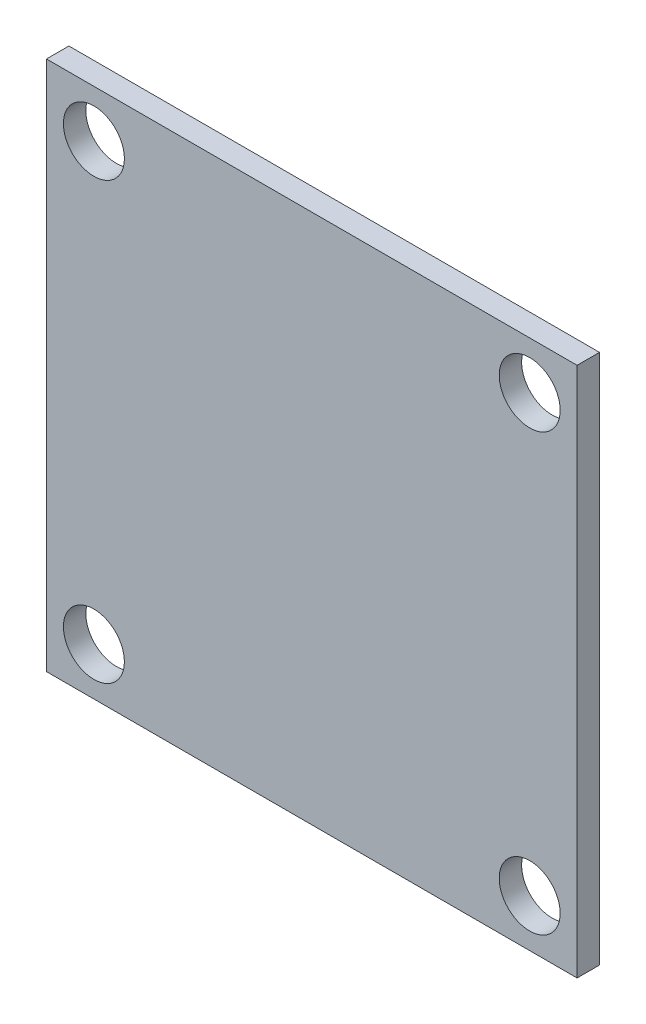
ISO-10303-21;
HEADER;
FILE_DESCRIPTION(('STEP AP214'),'2;1');
FILE_NAME('part.step','',(''),(''),'','','');
FILE_SCHEMA(('AUTOMOTIVE_DESIGN { 1 0 10303 214 1 1 1 1 }'));
ENDSEC;
DATA;
#1=APPLICATION_CONTEXT('core data for automotive mechanical design processes');
#2=APPLICATION_PROTOCOL_DEFINITION('international standard','automotive_design',2000,#1);
#3=PRODUCT_CONTEXT('',#1,'mechanical');
#4=PRODUCT('Part','Part','',(#3));
#5=PRODUCT_RELATED_PRODUCT_CATEGORY('part','',(#4));
#6=PRODUCT_DEFINITION_FORMATION('','',#4);
#7=PRODUCT_DEFINITION_CONTEXT('part definition',#1,'design');
#8=PRODUCT_DEFINITION('design','',#6,#7);
#9=PRODUCT_DEFINITION_SHAPE('','',#8);
#10=(LENGTH_UNIT() NAMED_UNIT(*) SI_UNIT(.MILLI.,.METRE.));
#11=(NAMED_UNIT(*) PLANE_ANGLE_UNIT() SI_UNIT($,.RADIAN.));
#12=(NAMED_UNIT(*) SI_UNIT($,.STERADIAN.) SOLID_ANGLE_UNIT());
#13=UNCERTAINTY_MEASURE_WITH_UNIT(LENGTH_MEASURE(1.E-05),#10,'distance_accuracy_value','');
#14=(GEOMETRIC_REPRESENTATION_CONTEXT(3) GLOBAL_UNCERTAINTY_ASSIGNED_CONTEXT((#13)) GLOBAL_UNIT_ASSIGNED_CONTEXT((#10,
#11,#12)) REPRESENTATION_CONTEXT('',''));
#15=CARTESIAN_POINT('',(0.,0.,0.));
#16=DIRECTION('',(0.,0.,1.));
#17=DIRECTION('',(1.,0.,0.));
#18=AXIS2_PLACEMENT_3D('',#15,#16,#17);
#19=CARTESIAN_POINT('',(14.2,14.2,1.2));
#20=DIRECTION('',(-1.,0.,0.));
#21=DIRECTION('',(0.,0.,1.));
#22=AXIS2_PLACEMENT_3D('',#19,#20,#21);
#23=PLANE('',#22);
#24=DIRECTION('',(0.,1.,0.));
#25=VECTOR('',#24,1.);
#26=CARTESIAN_POINT('',(14.2,14.2,0.));
#27=LINE('',#26,#25);
#28=CARTESIAN_POINT('',(14.2,-14.2,0.));
#29=VERTEX_POINT('',#28);
#30=CARTESIAN_POINT('',(14.2,14.2,0.));
#31=VERTEX_POINT('',#30);
#32=EDGE_CURVE('E98',#29,#31,#27,.T.);
#33=ORIENTED_EDGE('',*,*,#32,.T.);
#34=DIRECTION('',(0.,0.,-1.));
#35=VECTOR('',#34,1.);
#36=CARTESIAN_POINT('',(14.2,14.2,1.2));
#37=LINE('',#36,#35);
#38=CARTESIAN_POINT('',(14.2,14.2,1.2));
#39=VERTEX_POINT('',#38);
#40=EDGE_CURVE('E11',#39,#31,#37,.T.);
#41=ORIENTED_EDGE('',*,*,#40,.F.);
#42=DIRECTION('',(0.,1.,0.));
#43=VECTOR('',#42,1.);
#44=CARTESIAN_POINT('',(14.2,14.2,1.2));
#45=LINE('',#44,#43);
#46=CARTESIAN_POINT('',(14.2,-14.2,1.2));
#47=VERTEX_POINT('',#46);
#48=EDGE_CURVE('E86',#47,#39,#45,.T.);
#49=ORIENTED_EDGE('',*,*,#48,.F.);
#50=DIRECTION('',(0.,0.,-1.));
#51=VECTOR('',#50,1.);
#52=CARTESIAN_POINT('',(14.2,-14.2,1.2));
#53=LINE('',#52,#51);
#54=EDGE_CURVE('E94',#47,#29,#53,.T.);
#55=ORIENTED_EDGE('',*,*,#54,.T.);
#56=EDGE_LOOP('',(#33,#41,#49,#55));
#57=FACE_BOUND('',#56,.T.);
#58=ADVANCED_FACE('F35',(#57),#23,.F.);
#59=CARTESIAN_POINT('',(-14.2,14.2,1.2));
#60=DIRECTION('',(0.,-1.,0.));
#61=DIRECTION('',(0.,0.,-1.));
#62=AXIS2_PLACEMENT_3D('',#59,#60,#61);
#63=PLANE('',#62);
#64=DIRECTION('',(-1.,0.,0.));
#65=VECTOR('',#64,1.);
#66=CARTESIAN_POINT('',(-14.2,14.2,0.));
#67=LINE('',#66,#65);
#68=CARTESIAN_POINT('',(-14.2,14.2,0.));
#69=VERTEX_POINT('',#68);
#70=EDGE_CURVE('E90',#31,#69,#67,.T.);
#71=ORIENTED_EDGE('',*,*,#70,.T.);
#72=DIRECTION('',(0.,0.,-1.));
#73=VECTOR('',#72,1.);
#74=CARTESIAN_POINT('',(-14.2,14.2,1.2));
#75=LINE('',#74,#73);
#76=CARTESIAN_POINT('',(-14.2,14.2,1.2));
#77=VERTEX_POINT('',#76);
#78=EDGE_CURVE('E43',#77,#69,#75,.T.);
#79=ORIENTED_EDGE('',*,*,#78,.F.);
#80=DIRECTION('',(-1.,0.,0.));
#81=VECTOR('',#80,1.);
#82=CARTESIAN_POINT('',(-14.2,14.2,1.2));
#83=LINE('',#82,#81);
#84=EDGE_CURVE('E81',#39,#77,#83,.T.);
#85=ORIENTED_EDGE('',*,*,#84,.F.);
#86=ORIENTED_EDGE('',*,*,#40,.T.);
#87=EDGE_LOOP('',(#71,#79,#85,#86));
#88=FACE_BOUND('',#87,.T.);
#89=ADVANCED_FACE('F89',(#88),#63,.F.);
#90=CARTESIAN_POINT('',(-14.2,14.2,1.2));
#91=DIRECTION('',(1.,0.,0.));
#92=DIRECTION('',(0.,0.,-1.));
#93=AXIS2_PLACEMENT_3D('',#90,#91,#92);
#94=PLANE('',#93);
#95=DIRECTION('',(0.,-1.,0.));
#96=VECTOR('',#95,1.);
#97=CARTESIAN_POINT('',(-14.2,14.2,0.));
#98=LINE('',#97,#96);
#99=CARTESIAN_POINT('',(-14.2,-14.2,0.));
#100=VERTEX_POINT('',#99);
#101=EDGE_CURVE('E68',#69,#100,#98,.T.);
#102=ORIENTED_EDGE('',*,*,#101,.T.);
#103=DIRECTION('',(0.,0.,-1.));
#104=VECTOR('',#103,1.);
#105=CARTESIAN_POINT('',(-14.2,-14.2,1.2));
#106=LINE('',#105,#104);
#107=CARTESIAN_POINT('',(-14.2,-14.2,1.2));
#108=VERTEX_POINT('',#107);
#109=EDGE_CURVE('E91',#108,#100,#106,.T.);
#110=ORIENTED_EDGE('',*,*,#109,.F.);
#111=DIRECTION('',(0.,-1.,0.));
#112=VECTOR('',#111,1.);
#113=CARTESIAN_POINT('',(-14.2,14.2,1.2));
#114=LINE('',#113,#112);
#115=EDGE_CURVE('E84',#77,#108,#114,.T.);
#116=ORIENTED_EDGE('',*,*,#115,.F.);
#117=ORIENTED_EDGE('',*,*,#78,.T.);
#118=EDGE_LOOP('',(#102,#110,#116,#117));
#119=FACE_BOUND('',#118,.T.);
#120=ADVANCED_FACE('F92',(#119),#94,.F.);
#121=CARTESIAN_POINT('',(-14.2,-14.2,1.2));
#122=DIRECTION('',(0.,1.,0.));
#123=DIRECTION('',(0.,0.,1.));
#124=AXIS2_PLACEMENT_3D('',#121,#122,#123);
#125=PLANE('',#124);
#126=DIRECTION('',(1.,0.,0.));
#127=VECTOR('',#126,1.);
#128=CARTESIAN_POINT('',(-14.2,-14.2,0.));
#129=LINE('',#128,#127);
#130=EDGE_CURVE('E74',#100,#29,#129,.T.);
#131=ORIENTED_EDGE('',*,*,#130,.T.);
#132=ORIENTED_EDGE('',*,*,#54,.F.);
#133=DIRECTION('',(1.,0.,0.));
#134=VECTOR('',#133,1.);
#135=CARTESIAN_POINT('',(-14.2,-14.2,1.2));
#136=LINE('',#135,#134);
#137=EDGE_CURVE('E51',#108,#47,#136,.T.);
#138=ORIENTED_EDGE('',*,*,#137,.F.);
#139=ORIENTED_EDGE('',*,*,#109,.T.);
#140=EDGE_LOOP('',(#131,#132,#138,#139));
#141=FACE_BOUND('',#140,.T.);
#142=ADVANCED_FACE('F106',(#141),#125,.F.);
#143=CARTESIAN_POINT('',(0.,0.,1.2));
#144=DIRECTION('',(0.,0.,1.));
#145=DIRECTION('',(1.,0.,0.));
#146=AXIS2_PLACEMENT_3D('',#143,#144,#145);
#147=PLANE('',#146);
#148=CARTESIAN_POINT('',(-11.6625,11.66,1.2));
#149=DIRECTION('',(0.,0.,1.));
#150=DIRECTION('',(1.,0.,0.));
#151=AXIS2_PLACEMENT_3D('',#148,#149,#150);
#152=CIRCLE('',#151,1.63194999999999);
#153=CARTESIAN_POINT('',(-10.03055,11.66,1.2));
#154=VERTEX_POINT('',#153);
#155=EDGE_CURVE('E132',#154,#154,#152,.T.);
#156=ORIENTED_EDGE('',*,*,#155,.F.);
#157=EDGE_LOOP('',(#156));
#158=FACE_BOUND('',#157,.T.);
#159=CARTESIAN_POINT('',(11.6625,11.66,1.2));
#160=DIRECTION('',(0.,0.,1.));
#161=DIRECTION('',(1.,0.,0.));
#162=AXIS2_PLACEMENT_3D('',#159,#160,#161);
#163=CIRCLE('',#162,1.63194999999999);
#164=CARTESIAN_POINT('',(13.29445,11.66,1.2));
#165=VERTEX_POINT('',#164);
#166=EDGE_CURVE('E126',#165,#165,#163,.T.);
#167=ORIENTED_EDGE('',*,*,#166,.F.);
#168=EDGE_LOOP('',(#167));
#169=FACE_BOUND('',#168,.T.);
#170=CARTESIAN_POINT('',(-11.6625,-11.66,1.2));
#171=DIRECTION('',(0.,0.,1.));
#172=DIRECTION('',(1.,0.,0.));
#173=AXIS2_PLACEMENT_3D('',#170,#171,#172);
#174=CIRCLE('',#173,1.63194999999999);
#175=CARTESIAN_POINT('',(-10.03055,-11.66,1.2));
#176=VERTEX_POINT('',#175);
#177=EDGE_CURVE('E120',#176,#176,#174,.T.);
#178=ORIENTED_EDGE('',*,*,#177,.F.);
#179=EDGE_LOOP('',(#178));
#180=FACE_BOUND('',#179,.T.);
#181=CARTESIAN_POINT('',(11.6625,-11.66,1.2));
#182=DIRECTION('',(0.,0.,1.));
#183=DIRECTION('',(1.,0.,0.));
#184=AXIS2_PLACEMENT_3D('',#181,#182,#183);
#185=CIRCLE('',#184,1.63194999999999);
#186=CARTESIAN_POINT('',(13.29445,-11.66,1.2));
#187=VERTEX_POINT('',#186);
#188=EDGE_CURVE('E114',#187,#187,#185,.T.);
#189=ORIENTED_EDGE('',*,*,#188,.F.);
#190=EDGE_LOOP('',(#189));
#191=FACE_BOUND('',#190,.T.);
#192=ORIENTED_EDGE('',*,*,#48,.T.);
#193=ORIENTED_EDGE('',*,*,#84,.T.);
#194=ORIENTED_EDGE('',*,*,#115,.T.);
#195=ORIENTED_EDGE('',*,*,#137,.T.);
#196=EDGE_LOOP('',(#192,#193,#194,#195));
#197=FACE_BOUND('',#196,.T.);
#198=ADVANCED_FACE('F82',(#158,#169,#180,#191,#197),#147,.T.);
#199=CARTESIAN_POINT('',(0.,0.,0.));
#200=DIRECTION('',(0.,0.,1.));
#201=DIRECTION('',(1.,0.,0.));
#202=AXIS2_PLACEMENT_3D('',#199,#200,#201);
#203=PLANE('',#202);
#204=CARTESIAN_POINT('',(-11.6625,11.66,0.));
#205=DIRECTION('',(0.,0.,1.));
#206=DIRECTION('',(1.,0.,0.));
#207=AXIS2_PLACEMENT_3D('',#204,#205,#206);
#208=CIRCLE('',#207,1.63195);
#209=CARTESIAN_POINT('',(-10.03055,11.66,0.));
#210=VERTEX_POINT('',#209);
#211=EDGE_CURVE('E129',#210,#210,#208,.T.);
#212=ORIENTED_EDGE('',*,*,#211,.T.);
#213=EDGE_LOOP('',(#212));
#214=FACE_BOUND('',#213,.T.);
#215=CARTESIAN_POINT('',(11.6625,11.66,0.));
#216=DIRECTION('',(0.,0.,1.));
#217=DIRECTION('',(1.,0.,0.));
#218=AXIS2_PLACEMENT_3D('',#215,#216,#217);
#219=CIRCLE('',#218,1.63195);
#220=CARTESIAN_POINT('',(13.29445,11.66,0.));
#221=VERTEX_POINT('',#220);
#222=EDGE_CURVE('E123',#221,#221,#219,.T.);
#223=ORIENTED_EDGE('',*,*,#222,.T.);
#224=EDGE_LOOP('',(#223));
#225=FACE_BOUND('',#224,.T.);
#226=CARTESIAN_POINT('',(-11.6625,-11.66,0.));
#227=DIRECTION('',(0.,0.,1.));
#228=DIRECTION('',(1.,0.,0.));
#229=AXIS2_PLACEMENT_3D('',#226,#227,#228);
#230=CIRCLE('',#229,1.63195);
#231=CARTESIAN_POINT('',(-10.03055,-11.66,0.));
#232=VERTEX_POINT('',#231);
#233=EDGE_CURVE('E117',#232,#232,#230,.T.);
#234=ORIENTED_EDGE('',*,*,#233,.T.);
#235=EDGE_LOOP('',(#234));
#236=FACE_BOUND('',#235,.T.);
#237=CARTESIAN_POINT('',(11.6625,-11.66,0.));
#238=DIRECTION('',(0.,0.,1.));
#239=DIRECTION('',(1.,0.,0.));
#240=AXIS2_PLACEMENT_3D('',#237,#238,#239);
#241=CIRCLE('',#240,1.63195);
#242=CARTESIAN_POINT('',(13.29445,-11.66,0.));
#243=VERTEX_POINT('',#242);
#244=EDGE_CURVE('E101',#243,#243,#241,.T.);
#245=ORIENTED_EDGE('',*,*,#244,.T.);
#246=EDGE_LOOP('',(#245));
#247=FACE_BOUND('',#246,.T.);
#248=ORIENTED_EDGE('',*,*,#32,.F.);
#249=ORIENTED_EDGE('',*,*,#130,.F.);
#250=ORIENTED_EDGE('',*,*,#101,.F.);
#251=ORIENTED_EDGE('',*,*,#70,.F.);
#252=EDGE_LOOP('',(#248,#249,#250,#251));
#253=FACE_BOUND('',#252,.T.);
#254=ADVANCED_FACE('F109',(#214,#225,#236,#247,#253),#203,.F.);
#255=CARTESIAN_POINT('',(11.6625,-11.66,1.2));
#256=DIRECTION('',(0.,0.,1.));
#257=DIRECTION('',(1.,0.,0.));
#258=AXIS2_PLACEMENT_3D('',#255,#256,#257);
#259=CYLINDRICAL_SURFACE('',#258,1.63194999999999);
#260=ORIENTED_EDGE('',*,*,#244,.F.);
#261=EDGE_LOOP('',(#260));
#262=FACE_BOUND('',#261,.T.);
#263=ORIENTED_EDGE('',*,*,#188,.T.);
#264=EDGE_LOOP('',(#263));
#265=FACE_BOUND('',#264,.T.);
#266=ADVANCED_FACE('F147',(#262,#265),#259,.F.);
#267=CARTESIAN_POINT('',(-11.6625,-11.66,1.2));
#268=DIRECTION('',(0.,0.,1.));
#269=DIRECTION('',(1.,0.,0.));
#270=AXIS2_PLACEMENT_3D('',#267,#268,#269);
#271=CYLINDRICAL_SURFACE('',#270,1.63194999999999);
#272=ORIENTED_EDGE('',*,*,#233,.F.);
#273=EDGE_LOOP('',(#272));
#274=FACE_BOUND('',#273,.T.);
#275=ORIENTED_EDGE('',*,*,#177,.T.);
#276=EDGE_LOOP('',(#275));
#277=FACE_BOUND('',#276,.T.);
#278=ADVANCED_FACE('F149',(#274,#277),#271,.F.);
#279=CARTESIAN_POINT('',(11.6625,11.66,1.2));
#280=DIRECTION('',(0.,0.,1.));
#281=DIRECTION('',(1.,0.,0.));
#282=AXIS2_PLACEMENT_3D('',#279,#280,#281);
#283=CYLINDRICAL_SURFACE('',#282,1.63194999999999);
#284=ORIENTED_EDGE('',*,*,#222,.F.);
#285=EDGE_LOOP('',(#284));
#286=FACE_BOUND('',#285,.T.);
#287=ORIENTED_EDGE('',*,*,#166,.T.);
#288=EDGE_LOOP('',(#287));
#289=FACE_BOUND('',#288,.T.);
#290=ADVANCED_FACE('F156',(#286,#289),#283,.F.);
#291=CARTESIAN_POINT('',(-11.6625,11.66,1.2));
#292=DIRECTION('',(0.,0.,1.));
#293=DIRECTION('',(1.,0.,0.));
#294=AXIS2_PLACEMENT_3D('',#291,#292,#293);
#295=CYLINDRICAL_SURFACE('',#294,1.63194999999999);
#296=ORIENTED_EDGE('',*,*,#211,.F.);
#297=EDGE_LOOP('',(#296));
#298=FACE_BOUND('',#297,.T.);
#299=ORIENTED_EDGE('',*,*,#155,.T.);
#300=EDGE_LOOP('',(#299));
#301=FACE_BOUND('',#300,.T.);
#302=ADVANCED_FACE('F136',(#298,#301),#295,.F.);
#303=CLOSED_SHELL('',(#58,#89,#120,#142,#198,#254,#266,#278,#290,#302));
#304=MANIFOLD_SOLID_BREP('B2',#303);
#305=ADVANCED_BREP_SHAPE_REPRESENTATION('',(#18,#304),#14);
#306=SHAPE_DEFINITION_REPRESENTATION(#9,#305);
ENDSEC;
END-ISO-10303-21;
